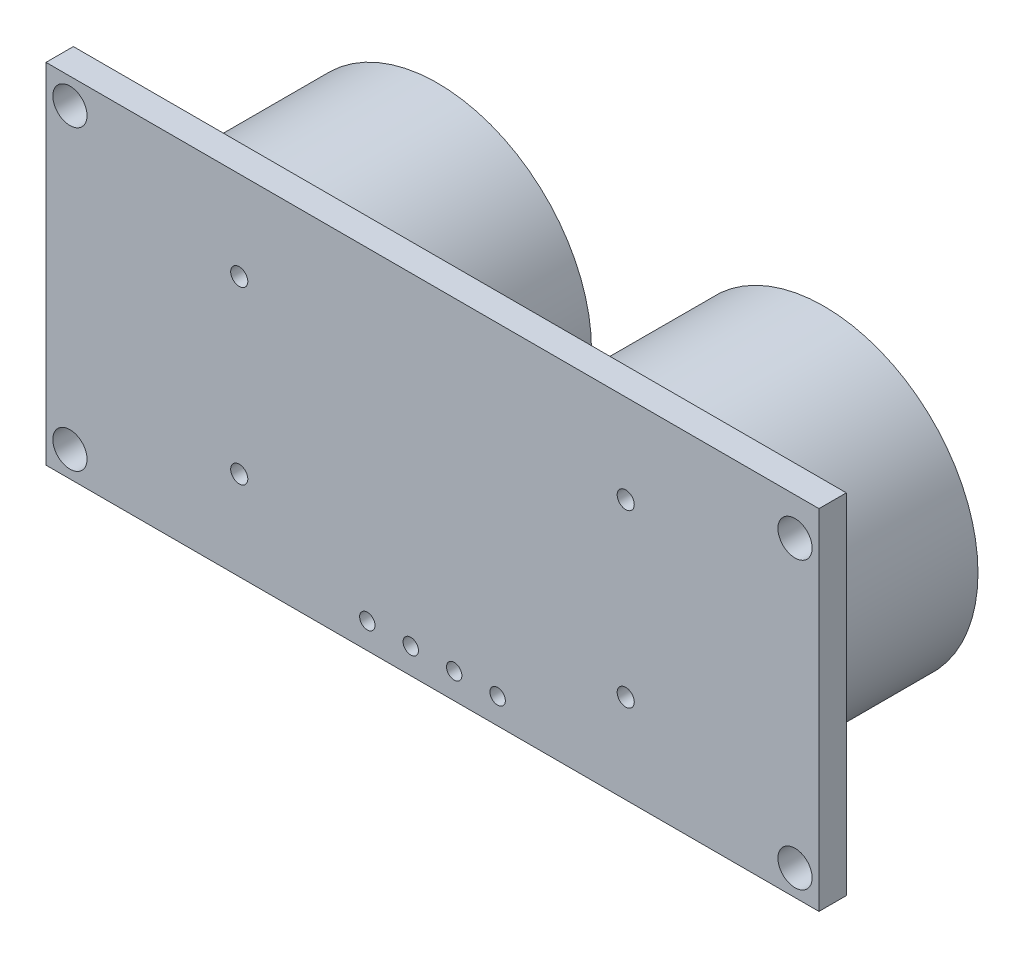
ISO-10303-21;
HEADER;
FILE_DESCRIPTION(('STEP AP214'),'2;1');
FILE_NAME('part.step','',(''),(''),'','','');
FILE_SCHEMA(('AUTOMOTIVE_DESIGN { 1 0 10303 214 1 1 1 1 }'));
ENDSEC;
DATA;
#1=APPLICATION_CONTEXT('core data for automotive mechanical design processes');
#2=APPLICATION_PROTOCOL_DEFINITION('international standard','automotive_design',2000,#1);
#3=PRODUCT_CONTEXT('',#1,'mechanical');
#4=PRODUCT('Part','Part','',(#3));
#5=PRODUCT_RELATED_PRODUCT_CATEGORY('part','',(#4));
#6=PRODUCT_DEFINITION_FORMATION('','',#4);
#7=PRODUCT_DEFINITION_CONTEXT('part definition',#1,'design');
#8=PRODUCT_DEFINITION('design','',#6,#7);
#9=PRODUCT_DEFINITION_SHAPE('','',#8);
#10=(LENGTH_UNIT() NAMED_UNIT(*) SI_UNIT(.MILLI.,.METRE.));
#11=(NAMED_UNIT(*) PLANE_ANGLE_UNIT() SI_UNIT($,.RADIAN.));
#12=(NAMED_UNIT(*) SI_UNIT($,.STERADIAN.) SOLID_ANGLE_UNIT());
#13=UNCERTAINTY_MEASURE_WITH_UNIT(LENGTH_MEASURE(1.E-05),#10,'distance_accuracy_value','');
#14=(GEOMETRIC_REPRESENTATION_CONTEXT(3) GLOBAL_UNCERTAINTY_ASSIGNED_CONTEXT((#13)) GLOBAL_UNIT_ASSIGNED_CONTEXT((#10,
#11,#12)) REPRESENTATION_CONTEXT('',''));
#15=CARTESIAN_POINT('',(0.,0.,0.));
#16=DIRECTION('',(0.,0.,1.));
#17=DIRECTION('',(1.,0.,0.));
#18=AXIS2_PLACEMENT_3D('',#15,#16,#17);
#19=CARTESIAN_POINT('',(-22.6,-10.2,1.6));
#20=DIRECTION('',(1.,0.,0.));
#21=DIRECTION('',(0.,0.,-1.));
#22=AXIS2_PLACEMENT_3D('',#19,#20,#21);
#23=PLANE('',#22);
#24=DIRECTION('',(0.,-1.,0.));
#25=VECTOR('',#24,1.);
#26=CARTESIAN_POINT('',(-22.6,-10.2,0.));
#27=LINE('',#26,#25);
#28=CARTESIAN_POINT('',(-22.6,10.2,0.));
#29=VERTEX_POINT('',#28);
#30=CARTESIAN_POINT('',(-22.6,-10.2,0.));
#31=VERTEX_POINT('',#30);
#32=EDGE_CURVE('E102',#29,#31,#27,.T.);
#33=ORIENTED_EDGE('',*,*,#32,.T.);
#34=DIRECTION('',(0.,0.,-1.));
#35=VECTOR('',#34,1.);
#36=CARTESIAN_POINT('',(-22.6,-10.2,1.6));
#37=LINE('',#36,#35);
#38=CARTESIAN_POINT('',(-22.6,-10.2,1.6));
#39=VERTEX_POINT('',#38);
#40=EDGE_CURVE('E93',#39,#31,#37,.T.);
#41=ORIENTED_EDGE('',*,*,#40,.F.);
#42=DIRECTION('',(0.,-1.,0.));
#43=VECTOR('',#42,1.);
#44=CARTESIAN_POINT('',(-22.6,-10.2,1.6));
#45=LINE('',#44,#43);
#46=CARTESIAN_POINT('',(-22.6,10.2,1.6));
#47=VERTEX_POINT('',#46);
#48=EDGE_CURVE('E87',#47,#39,#45,.T.);
#49=ORIENTED_EDGE('',*,*,#48,.F.);
#50=DIRECTION('',(0.,0.,-1.));
#51=VECTOR('',#50,1.);
#52=CARTESIAN_POINT('',(-22.6,10.2,1.6));
#53=LINE('',#52,#51);
#54=EDGE_CURVE('E98',#47,#29,#53,.T.);
#55=ORIENTED_EDGE('',*,*,#54,.T.);
#56=EDGE_LOOP('',(#33,#41,#49,#55));
#57=FACE_BOUND('',#56,.T.);
#58=ADVANCED_FACE('F35',(#57),#23,.F.);
#59=CARTESIAN_POINT('',(22.6,-10.2,1.6));
#60=DIRECTION('',(0.,1.,0.));
#61=DIRECTION('',(-1.,0.,0.));
#62=AXIS2_PLACEMENT_3D('',#59,#60,#61);
#63=PLANE('',#62);
#64=DIRECTION('',(1.,0.,0.));
#65=VECTOR('',#64,1.);
#66=CARTESIAN_POINT('',(22.6,-10.2,0.));
#67=LINE('',#66,#65);
#68=CARTESIAN_POINT('',(22.6,-10.2,0.));
#69=VERTEX_POINT('',#68);
#70=EDGE_CURVE('E92',#31,#69,#67,.T.);
#71=ORIENTED_EDGE('',*,*,#70,.T.);
#72=DIRECTION('',(0.,0.,-1.));
#73=VECTOR('',#72,1.);
#74=CARTESIAN_POINT('',(22.6,-10.2,1.6));
#75=LINE('',#74,#73);
#76=CARTESIAN_POINT('',(22.6,-10.2,1.6));
#77=VERTEX_POINT('',#76);
#78=EDGE_CURVE('E90',#77,#69,#75,.T.);
#79=ORIENTED_EDGE('',*,*,#78,.F.);
#80=DIRECTION('',(1.,0.,0.));
#81=VECTOR('',#80,1.);
#82=CARTESIAN_POINT('',(22.6,-10.2,1.6));
#83=LINE('',#82,#81);
#84=EDGE_CURVE('E82',#39,#77,#83,.T.);
#85=ORIENTED_EDGE('',*,*,#84,.F.);
#86=ORIENTED_EDGE('',*,*,#40,.T.);
#87=EDGE_LOOP('',(#71,#79,#85,#86));
#88=FACE_BOUND('',#87,.T.);
#89=ADVANCED_FACE('F91',(#88),#63,.F.);
#90=CARTESIAN_POINT('',(22.6,-10.2,1.6));
#91=DIRECTION('',(-1.,0.,0.));
#92=DIRECTION('',(0.,0.,1.));
#93=AXIS2_PLACEMENT_3D('',#90,#91,#92);
#94=PLANE('',#93);
#95=DIRECTION('',(0.,1.,0.));
#96=VECTOR('',#95,1.);
#97=CARTESIAN_POINT('',(22.6,-10.2,0.));
#98=LINE('',#97,#96);
#99=CARTESIAN_POINT('',(22.6,10.2,0.));
#100=VERTEX_POINT('',#99);
#101=EDGE_CURVE('E68',#69,#100,#98,.T.);
#102=ORIENTED_EDGE('',*,*,#101,.T.);
#103=DIRECTION('',(0.,0.,-1.));
#104=VECTOR('',#103,1.);
#105=CARTESIAN_POINT('',(22.6,10.2,1.6));
#106=LINE('',#105,#104);
#107=CARTESIAN_POINT('',(22.6,10.2,1.6));
#108=VERTEX_POINT('',#107);
#109=EDGE_CURVE('E94',#108,#100,#106,.T.);
#110=ORIENTED_EDGE('',*,*,#109,.F.);
#111=DIRECTION('',(0.,1.,0.));
#112=VECTOR('',#111,1.);
#113=CARTESIAN_POINT('',(22.6,-10.2,1.6));
#114=LINE('',#113,#112);
#115=EDGE_CURVE('E85',#77,#108,#114,.T.);
#116=ORIENTED_EDGE('',*,*,#115,.F.);
#117=ORIENTED_EDGE('',*,*,#78,.T.);
#118=EDGE_LOOP('',(#102,#110,#116,#117));
#119=FACE_BOUND('',#118,.T.);
#120=ADVANCED_FACE('F96',(#119),#94,.F.);
#121=CARTESIAN_POINT('',(22.6,10.2,1.6));
#122=DIRECTION('',(0.,-1.,0.));
#123=DIRECTION('',(1.,0.,0.));
#124=AXIS2_PLACEMENT_3D('',#121,#122,#123);
#125=PLANE('',#124);
#126=DIRECTION('',(-1.,0.,0.));
#127=VECTOR('',#126,1.);
#128=CARTESIAN_POINT('',(22.6,10.2,0.));
#129=LINE('',#128,#127);
#130=EDGE_CURVE('E74',#100,#29,#129,.T.);
#131=ORIENTED_EDGE('',*,*,#130,.T.);
#132=ORIENTED_EDGE('',*,*,#54,.F.);
#133=DIRECTION('',(-1.,0.,0.));
#134=VECTOR('',#133,1.);
#135=CARTESIAN_POINT('',(22.6,10.2,1.6));
#136=LINE('',#135,#134);
#137=EDGE_CURVE('E51',#108,#47,#136,.T.);
#138=ORIENTED_EDGE('',*,*,#137,.F.);
#139=ORIENTED_EDGE('',*,*,#109,.T.);
#140=EDGE_LOOP('',(#131,#132,#138,#139));
#141=FACE_BOUND('',#140,.T.);
#142=ADVANCED_FACE('F155',(#141),#125,.F.);
#143=CARTESIAN_POINT('',(0.,0.,1.6));
#144=DIRECTION('',(0.,0.,1.));
#145=DIRECTION('',(1.,0.,0.));
#146=AXIS2_PLACEMENT_3D('',#143,#144,#145);
#147=PLANE('',#146);
#148=CARTESIAN_POINT('',(-11.3,5.00000000000001,1.6));
#149=DIRECTION('',(0.,0.,1.));
#150=DIRECTION('',(-1.,0.,0.));
#151=AXIS2_PLACEMENT_3D('',#148,#149,#150);
#152=CIRCLE('',#151,0.500000000000001);
#153=CARTESIAN_POINT('',(-11.8,5.00000000000001,1.6));
#154=VERTEX_POINT('',#153);
#155=EDGE_CURVE('E397',#154,#154,#152,.T.);
#156=ORIENTED_EDGE('',*,*,#155,.F.);
#157=EDGE_LOOP('',(#156));
#158=FACE_BOUND('',#157,.T.);
#159=CARTESIAN_POINT('',(-11.3,-4.99999999999999,1.6));
#160=DIRECTION('',(0.,0.,1.));
#161=DIRECTION('',(-1.,0.,0.));
#162=AXIS2_PLACEMENT_3D('',#159,#160,#161);
#163=CIRCLE('',#162,0.500000000000001);
#164=CARTESIAN_POINT('',(-11.8,-4.99999999999999,1.6));
#165=VERTEX_POINT('',#164);
#166=EDGE_CURVE('E410',#165,#165,#163,.T.);
#167=ORIENTED_EDGE('',*,*,#166,.F.);
#168=EDGE_LOOP('',(#167));
#169=FACE_BOUND('',#168,.T.);
#170=CARTESIAN_POINT('',(11.3,-4.99999999999999,1.6));
#171=DIRECTION('',(0.,0.,1.));
#172=DIRECTION('',(1.,0.,0.));
#173=AXIS2_PLACEMENT_3D('',#170,#171,#172);
#174=CIRCLE('',#173,0.500000000000001);
#175=CARTESIAN_POINT('',(11.8,-4.99999999999999,1.6));
#176=VERTEX_POINT('',#175);
#177=EDGE_CURVE('E404',#176,#176,#174,.T.);
#178=ORIENTED_EDGE('',*,*,#177,.F.);
#179=EDGE_LOOP('',(#178));
#180=FACE_BOUND('',#179,.T.);
#181=CARTESIAN_POINT('',(11.3,5.00000000000001,1.6));
#182=DIRECTION('',(0.,0.,1.));
#183=DIRECTION('',(1.,0.,0.));
#184=AXIS2_PLACEMENT_3D('',#181,#182,#183);
#185=CIRCLE('',#184,0.500000000000001);
#186=CARTESIAN_POINT('',(11.8,5.00000000000001,1.6));
#187=VERTEX_POINT('',#186);
#188=EDGE_CURVE('E403',#187,#187,#185,.T.);
#189=ORIENTED_EDGE('',*,*,#188,.F.);
#190=EDGE_LOOP('',(#189));
#191=FACE_BOUND('',#190,.T.);
#192=CARTESIAN_POINT('',(-3.81,-8.7,1.6));
#193=DIRECTION('',(0.,0.,1.));
#194=DIRECTION('',(1.,0.,0.));
#195=AXIS2_PLACEMENT_3D('',#192,#193,#194);
#196=CIRCLE('',#195,0.45);
#197=CARTESIAN_POINT('',(-3.36,-8.7,1.6));
#198=VERTEX_POINT('',#197);
#199=EDGE_CURVE('E425',#198,#198,#196,.T.);
#200=ORIENTED_EDGE('',*,*,#199,.F.);
#201=EDGE_LOOP('',(#200));
#202=FACE_BOUND('',#201,.T.);
#203=CARTESIAN_POINT('',(21.2,8.,1.6));
#204=DIRECTION('',(0.,0.,1.));
#205=DIRECTION('',(1.,0.,0.));
#206=AXIS2_PLACEMENT_3D('',#203,#204,#205);
#207=CIRCLE('',#206,1.);
#208=CARTESIAN_POINT('',(22.2,8.,1.6));
#209=VERTEX_POINT('',#208);
#210=EDGE_CURVE('E438',#209,#209,#207,.T.);
#211=ORIENTED_EDGE('',*,*,#210,.F.);
#212=EDGE_LOOP('',(#211));
#213=FACE_BOUND('',#212,.T.);
#214=CARTESIAN_POINT('',(-21.2,8.7,1.6));
#215=DIRECTION('',(0.,0.,1.));
#216=DIRECTION('',(1.,0.,0.));
#217=AXIS2_PLACEMENT_3D('',#214,#215,#216);
#218=CIRCLE('',#217,1.);
#219=CARTESIAN_POINT('',(-20.2,8.7,1.6));
#220=VERTEX_POINT('',#219);
#221=EDGE_CURVE('E437',#220,#220,#218,.T.);
#222=ORIENTED_EDGE('',*,*,#221,.F.);
#223=EDGE_LOOP('',(#222));
#224=FACE_BOUND('',#223,.T.);
#225=CARTESIAN_POINT('',(21.2,-8.7,1.6));
#226=DIRECTION('',(0.,0.,1.));
#227=DIRECTION('',(1.,0.,0.));
#228=AXIS2_PLACEMENT_3D('',#225,#226,#227);
#229=CIRCLE('',#228,1.);
#230=CARTESIAN_POINT('',(22.2,-8.7,1.6));
#231=VERTEX_POINT('',#230);
#232=EDGE_CURVE('E446',#231,#231,#229,.T.);
#233=ORIENTED_EDGE('',*,*,#232,.F.);
#234=EDGE_LOOP('',(#233));
#235=FACE_BOUND('',#234,.T.);
#236=CARTESIAN_POINT('',(-1.27,-8.7,1.6));
#237=DIRECTION('',(0.,0.,1.));
#238=DIRECTION('',(1.,0.,0.));
#239=AXIS2_PLACEMENT_3D('',#236,#237,#238);
#240=CIRCLE('',#239,0.45);
#241=CARTESIAN_POINT('',(-0.819999999999998,-8.7,1.6));
#242=VERTEX_POINT('',#241);
#243=EDGE_CURVE('E426',#242,#242,#240,.T.);
#244=ORIENTED_EDGE('',*,*,#243,.F.);
#245=EDGE_LOOP('',(#244));
#246=FACE_BOUND('',#245,.T.);
#247=CARTESIAN_POINT('',(1.27,-8.7,1.6));
#248=DIRECTION('',(0.,0.,1.));
#249=DIRECTION('',(1.,0.,0.));
#250=AXIS2_PLACEMENT_3D('',#247,#248,#249);
#251=CIRCLE('',#250,0.45);
#252=CARTESIAN_POINT('',(1.72,-8.7,1.6));
#253=VERTEX_POINT('',#252);
#254=EDGE_CURVE('E430',#253,#253,#251,.T.);
#255=ORIENTED_EDGE('',*,*,#254,.F.);
#256=EDGE_LOOP('',(#255));
#257=FACE_BOUND('',#256,.T.);
#258=CARTESIAN_POINT('',(3.81,-8.7,1.6));
#259=DIRECTION('',(0.,0.,1.));
#260=DIRECTION('',(1.,0.,0.));
#261=AXIS2_PLACEMENT_3D('',#258,#259,#260);
#262=CIRCLE('',#261,0.45);
#263=CARTESIAN_POINT('',(4.26,-8.7,1.6));
#264=VERTEX_POINT('',#263);
#265=EDGE_CURVE('E421',#264,#264,#262,.T.);
#266=ORIENTED_EDGE('',*,*,#265,.F.);
#267=EDGE_LOOP('',(#266));
#268=FACE_BOUND('',#267,.T.);
#269=CARTESIAN_POINT('',(-21.2,-8.7,1.6));
#270=DIRECTION('',(0.,0.,1.));
#271=DIRECTION('',(1.,0.,0.));
#272=AXIS2_PLACEMENT_3D('',#269,#270,#271);
#273=CIRCLE('',#272,1.);
#274=CARTESIAN_POINT('',(-20.2,-8.7,1.6));
#275=VERTEX_POINT('',#274);
#276=EDGE_CURVE('E445',#275,#275,#273,.T.);
#277=ORIENTED_EDGE('',*,*,#276,.F.);
#278=EDGE_LOOP('',(#277));
#279=FACE_BOUND('',#278,.T.);
#280=ORIENTED_EDGE('',*,*,#48,.T.);
#281=ORIENTED_EDGE('',*,*,#84,.T.);
#282=ORIENTED_EDGE('',*,*,#115,.T.);
#283=ORIENTED_EDGE('',*,*,#137,.T.);
#284=EDGE_LOOP('',(#280,#281,#282,#283));
#285=FACE_BOUND('',#284,.T.);
#286=ADVANCED_FACE('F83',(#158,#169,#180,#191,#202,#213,#224,#235,#246,#257,#268,#279,#285),
#147,.T.);
#287=CARTESIAN_POINT('',(0.,0.,0.));
#288=DIRECTION('',(0.,0.,1.));
#289=DIRECTION('',(1.,0.,0.));
#290=AXIS2_PLACEMENT_3D('',#287,#288,#289);
#291=PLANE('',#290);
#292=CARTESIAN_POINT('',(-11.3,0.,0.));
#293=DIRECTION('',(0.,0.,1.));
#294=DIRECTION('',(1.,0.,0.));
#295=AXIS2_PLACEMENT_3D('',#292,#293,#294);
#296=CIRCLE('',#295,9.);
#297=CARTESIAN_POINT('',(-2.3,0.,0.));
#298=VERTEX_POINT('',#297);
#299=EDGE_CURVE('E11',#298,#298,#296,.F.);
#300=ORIENTED_EDGE('',*,*,#299,.F.);
#301=EDGE_LOOP('',(#300));
#302=FACE_BOUND('',#301,.T.);
#303=CARTESIAN_POINT('',(11.3,0.,0.));
#304=DIRECTION('',(0.,0.,1.));
#305=DIRECTION('',(1.,0.,0.));
#306=AXIS2_PLACEMENT_3D('',#303,#304,#305);
#307=CIRCLE('',#306,9.);
#308=CARTESIAN_POINT('',(20.3,0.,0.));
#309=VERTEX_POINT('',#308);
#310=EDGE_CURVE('E43',#309,#309,#307,.F.);
#311=ORIENTED_EDGE('',*,*,#310,.F.);
#312=EDGE_LOOP('',(#311));
#313=FACE_BOUND('',#312,.T.);
#314=CARTESIAN_POINT('',(-3.81,-8.7,0.));
#315=DIRECTION('',(0.,0.,1.));
#316=DIRECTION('',(1.,0.,0.));
#317=AXIS2_PLACEMENT_3D('',#314,#315,#316);
#318=CIRCLE('',#317,0.45);
#319=CARTESIAN_POINT('',(-3.36,-8.7,0.));
#320=VERTEX_POINT('',#319);
#321=EDGE_CURVE('E125',#320,#320,#318,.T.);
#322=ORIENTED_EDGE('',*,*,#321,.T.);
#323=EDGE_LOOP('',(#322));
#324=FACE_BOUND('',#323,.T.);
#325=CARTESIAN_POINT('',(21.2,8.,0.));
#326=DIRECTION('',(0.,0.,1.));
#327=DIRECTION('',(1.,0.,0.));
#328=AXIS2_PLACEMENT_3D('',#325,#326,#327);
#329=CIRCLE('',#328,1.);
#330=CARTESIAN_POINT('',(22.2,8.,0.));
#331=VERTEX_POINT('',#330);
#332=EDGE_CURVE('E129',#331,#331,#329,.T.);
#333=ORIENTED_EDGE('',*,*,#332,.T.);
#334=EDGE_LOOP('',(#333));
#335=FACE_BOUND('',#334,.T.);
#336=CARTESIAN_POINT('',(-21.2,8.7,0.));
#337=DIRECTION('',(0.,0.,1.));
#338=DIRECTION('',(1.,0.,0.));
#339=AXIS2_PLACEMENT_3D('',#336,#337,#338);
#340=CIRCLE('',#339,1.);
#341=CARTESIAN_POINT('',(-20.2,8.7,0.));
#342=VERTEX_POINT('',#341);
#343=EDGE_CURVE('E133',#342,#342,#340,.T.);
#344=ORIENTED_EDGE('',*,*,#343,.T.);
#345=EDGE_LOOP('',(#344));
#346=FACE_BOUND('',#345,.T.);
#347=CARTESIAN_POINT('',(21.2,-8.7,0.));
#348=DIRECTION('',(0.,0.,1.));
#349=DIRECTION('',(1.,0.,0.));
#350=AXIS2_PLACEMENT_3D('',#347,#348,#349);
#351=CIRCLE('',#350,1.);
#352=CARTESIAN_POINT('',(22.2,-8.7,0.));
#353=VERTEX_POINT('',#352);
#354=EDGE_CURVE('E137',#353,#353,#351,.T.);
#355=ORIENTED_EDGE('',*,*,#354,.T.);
#356=EDGE_LOOP('',(#355));
#357=FACE_BOUND('',#356,.T.);
#358=CARTESIAN_POINT('',(-1.27,-8.7,0.));
#359=DIRECTION('',(0.,0.,1.));
#360=DIRECTION('',(1.,0.,0.));
#361=AXIS2_PLACEMENT_3D('',#358,#359,#360);
#362=CIRCLE('',#361,0.45);
#363=CARTESIAN_POINT('',(-0.819999999999998,-8.7,0.));
#364=VERTEX_POINT('',#363);
#365=EDGE_CURVE('E141',#364,#364,#362,.T.);
#366=ORIENTED_EDGE('',*,*,#365,.T.);
#367=EDGE_LOOP('',(#366));
#368=FACE_BOUND('',#367,.T.);
#369=CARTESIAN_POINT('',(1.27,-8.7,0.));
#370=DIRECTION('',(0.,0.,1.));
#371=DIRECTION('',(1.,0.,0.));
#372=AXIS2_PLACEMENT_3D('',#369,#370,#371);
#373=CIRCLE('',#372,0.45);
#374=CARTESIAN_POINT('',(1.72,-8.7,0.));
#375=VERTEX_POINT('',#374);
#376=EDGE_CURVE('E145',#375,#375,#373,.T.);
#377=ORIENTED_EDGE('',*,*,#376,.T.);
#378=EDGE_LOOP('',(#377));
#379=FACE_BOUND('',#378,.T.);
#380=CARTESIAN_POINT('',(3.81,-8.7,0.));
#381=DIRECTION('',(0.,0.,1.));
#382=DIRECTION('',(1.,0.,0.));
#383=AXIS2_PLACEMENT_3D('',#380,#381,#382);
#384=CIRCLE('',#383,0.45);
#385=CARTESIAN_POINT('',(4.26,-8.7,0.));
#386=VERTEX_POINT('',#385);
#387=EDGE_CURVE('E149',#386,#386,#384,.T.);
#388=ORIENTED_EDGE('',*,*,#387,.T.);
#389=EDGE_LOOP('',(#388));
#390=FACE_BOUND('',#389,.T.);
#391=CARTESIAN_POINT('',(-21.2,-8.7,0.));
#392=DIRECTION('',(0.,0.,1.));
#393=DIRECTION('',(1.,0.,0.));
#394=AXIS2_PLACEMENT_3D('',#391,#392,#393);
#395=CIRCLE('',#394,1.);
#396=CARTESIAN_POINT('',(-20.2,-8.7,0.));
#397=VERTEX_POINT('',#396);
#398=EDGE_CURVE('E105',#397,#397,#395,.T.);
#399=ORIENTED_EDGE('',*,*,#398,.T.);
#400=EDGE_LOOP('',(#399));
#401=FACE_BOUND('',#400,.T.);
#402=ORIENTED_EDGE('',*,*,#32,.F.);
#403=ORIENTED_EDGE('',*,*,#130,.F.);
#404=ORIENTED_EDGE('',*,*,#101,.F.);
#405=ORIENTED_EDGE('',*,*,#70,.F.);
#406=EDGE_LOOP('',(#402,#403,#404,#405));
#407=FACE_BOUND('',#406,.T.);
#408=ADVANCED_FACE('F116',(#302,#313,#324,#335,#346,#357,#368,#379,#390,#401,#407),#291,.F.);
#409=CARTESIAN_POINT('',(-21.2,-8.7,0.));
#410=DIRECTION('',(0.,0.,1.));
#411=DIRECTION('',(1.,0.,0.));
#412=AXIS2_PLACEMENT_3D('',#409,#410,#411);
#413=CYLINDRICAL_SURFACE('',#412,1.);
#414=ORIENTED_EDGE('',*,*,#398,.F.);
#415=EDGE_LOOP('',(#414));
#416=FACE_BOUND('',#415,.T.);
#417=ORIENTED_EDGE('',*,*,#276,.T.);
#418=EDGE_LOOP('',(#417));
#419=FACE_BOUND('',#418,.T.);
#420=ADVANCED_FACE('F119',(#416,#419),#413,.F.);
#421=CARTESIAN_POINT('',(3.81,-8.7,0.));
#422=DIRECTION('',(0.,0.,1.));
#423=DIRECTION('',(1.,0.,0.));
#424=AXIS2_PLACEMENT_3D('',#421,#422,#423);
#425=CYLINDRICAL_SURFACE('',#424,0.45);
#426=ORIENTED_EDGE('',*,*,#387,.F.);
#427=EDGE_LOOP('',(#426));
#428=FACE_BOUND('',#427,.T.);
#429=ORIENTED_EDGE('',*,*,#265,.T.);
#430=EDGE_LOOP('',(#429));
#431=FACE_BOUND('',#430,.T.);
#432=ADVANCED_FACE('F189',(#428,#431),#425,.F.);
#433=CARTESIAN_POINT('',(1.27,-8.7,0.));
#434=DIRECTION('',(0.,0.,1.));
#435=DIRECTION('',(1.,0.,0.));
#436=AXIS2_PLACEMENT_3D('',#433,#434,#435);
#437=CYLINDRICAL_SURFACE('',#436,0.45);
#438=ORIENTED_EDGE('',*,*,#376,.F.);
#439=EDGE_LOOP('',(#438));
#440=FACE_BOUND('',#439,.T.);
#441=ORIENTED_EDGE('',*,*,#254,.T.);
#442=EDGE_LOOP('',(#441));
#443=FACE_BOUND('',#442,.T.);
#444=ADVANCED_FACE('F200',(#440,#443),#437,.F.);
#445=CARTESIAN_POINT('',(-1.27,-8.7,0.));
#446=DIRECTION('',(0.,0.,1.));
#447=DIRECTION('',(1.,0.,0.));
#448=AXIS2_PLACEMENT_3D('',#445,#446,#447);
#449=CYLINDRICAL_SURFACE('',#448,0.45);
#450=ORIENTED_EDGE('',*,*,#365,.F.);
#451=EDGE_LOOP('',(#450));
#452=FACE_BOUND('',#451,.T.);
#453=ORIENTED_EDGE('',*,*,#243,.T.);
#454=EDGE_LOOP('',(#453));
#455=FACE_BOUND('',#454,.T.);
#456=ADVANCED_FACE('F210',(#452,#455),#449,.F.);
#457=CARTESIAN_POINT('',(21.2,-8.7,0.));
#458=DIRECTION('',(0.,0.,1.));
#459=DIRECTION('',(1.,0.,0.));
#460=AXIS2_PLACEMENT_3D('',#457,#458,#459);
#461=CYLINDRICAL_SURFACE('',#460,1.);
#462=ORIENTED_EDGE('',*,*,#354,.F.);
#463=EDGE_LOOP('',(#462));
#464=FACE_BOUND('',#463,.T.);
#465=ORIENTED_EDGE('',*,*,#232,.T.);
#466=EDGE_LOOP('',(#465));
#467=FACE_BOUND('',#466,.T.);
#468=ADVANCED_FACE('F220',(#464,#467),#461,.F.);
#469=CARTESIAN_POINT('',(-21.2,8.7,0.));
#470=DIRECTION('',(0.,0.,1.));
#471=DIRECTION('',(1.,0.,0.));
#472=AXIS2_PLACEMENT_3D('',#469,#470,#471);
#473=CYLINDRICAL_SURFACE('',#472,1.);
#474=ORIENTED_EDGE('',*,*,#343,.F.);
#475=EDGE_LOOP('',(#474));
#476=FACE_BOUND('',#475,.T.);
#477=ORIENTED_EDGE('',*,*,#221,.T.);
#478=EDGE_LOOP('',(#477));
#479=FACE_BOUND('',#478,.T.);
#480=ADVANCED_FACE('F230',(#476,#479),#473,.F.);
#481=CARTESIAN_POINT('',(21.2,8.,0.));
#482=DIRECTION('',(0.,0.,1.));
#483=DIRECTION('',(1.,0.,0.));
#484=AXIS2_PLACEMENT_3D('',#481,#482,#483);
#485=CYLINDRICAL_SURFACE('',#484,1.);
#486=ORIENTED_EDGE('',*,*,#332,.F.);
#487=EDGE_LOOP('',(#486));
#488=FACE_BOUND('',#487,.T.);
#489=ORIENTED_EDGE('',*,*,#210,.T.);
#490=EDGE_LOOP('',(#489));
#491=FACE_BOUND('',#490,.T.);
#492=ADVANCED_FACE('F240',(#488,#491),#485,.F.);
#493=CARTESIAN_POINT('',(-3.81,-8.7,0.));
#494=DIRECTION('',(0.,0.,1.));
#495=DIRECTION('',(1.,0.,0.));
#496=AXIS2_PLACEMENT_3D('',#493,#494,#495);
#497=CYLINDRICAL_SURFACE('',#496,0.45);
#498=ORIENTED_EDGE('',*,*,#321,.F.);
#499=EDGE_LOOP('',(#498));
#500=FACE_BOUND('',#499,.T.);
#501=ORIENTED_EDGE('',*,*,#199,.T.);
#502=EDGE_LOOP('',(#501));
#503=FACE_BOUND('',#502,.T.);
#504=ADVANCED_FACE('F250',(#500,#503),#497,.F.);
#505=CARTESIAN_POINT('',(11.3,5.00000000000001,0.));
#506=DIRECTION('',(0.,0.,1.));
#507=DIRECTION('',(1.,0.,0.));
#508=AXIS2_PLACEMENT_3D('',#505,#506,#507);
#509=CYLINDRICAL_SURFACE('',#508,0.500000000000001);
#510=CARTESIAN_POINT('',(11.3,5.00000000000001,0.));
#511=DIRECTION('',(0.,0.,1.));
#512=DIRECTION('',(1.,0.,0.));
#513=AXIS2_PLACEMENT_3D('',#510,#511,#512);
#514=CIRCLE('',#513,0.500000000000001);
#515=CARTESIAN_POINT('',(11.8,5.00000000000001,0.));
#516=VERTEX_POINT('',#515);
#517=EDGE_CURVE('E418',#516,#516,#514,.T.);
#518=ORIENTED_EDGE('',*,*,#517,.F.);
#519=EDGE_LOOP('',(#518));
#520=FACE_BOUND('',#519,.T.);
#521=ORIENTED_EDGE('',*,*,#188,.T.);
#522=EDGE_LOOP('',(#521));
#523=FACE_BOUND('',#522,.T.);
#524=ADVANCED_FACE('F260',(#520,#523),#509,.F.);
#525=CARTESIAN_POINT('',(11.3,-4.99999999999999,0.));
#526=DIRECTION('',(0.,0.,1.));
#527=DIRECTION('',(1.,0.,0.));
#528=AXIS2_PLACEMENT_3D('',#525,#526,#527);
#529=CYLINDRICAL_SURFACE('',#528,0.500000000000001);
#530=CARTESIAN_POINT('',(11.3,-4.99999999999999,0.));
#531=DIRECTION('',(0.,0.,1.));
#532=DIRECTION('',(1.,0.,0.));
#533=AXIS2_PLACEMENT_3D('',#530,#531,#532);
#534=CIRCLE('',#533,0.500000000000001);
#535=CARTESIAN_POINT('',(11.8,-4.99999999999999,0.));
#536=VERTEX_POINT('',#535);
#537=EDGE_CURVE('E400',#536,#536,#534,.T.);
#538=ORIENTED_EDGE('',*,*,#537,.F.);
#539=EDGE_LOOP('',(#538));
#540=FACE_BOUND('',#539,.T.);
#541=ORIENTED_EDGE('',*,*,#177,.T.);
#542=EDGE_LOOP('',(#541));
#543=FACE_BOUND('',#542,.T.);
#544=ADVANCED_FACE('F275',(#540,#543),#529,.F.);
#545=CARTESIAN_POINT('',(-11.3,-4.99999999999999,0.));
#546=DIRECTION('',(0.,0.,1.));
#547=DIRECTION('',(1.,0.,0.));
#548=AXIS2_PLACEMENT_3D('',#545,#546,#547);
#549=CYLINDRICAL_SURFACE('',#548,0.500000000000001);
#550=CARTESIAN_POINT('',(-11.3,-4.99999999999999,0.));
#551=DIRECTION('',(0.,0.,1.));
#552=DIRECTION('',(-1.,0.,0.));
#553=AXIS2_PLACEMENT_3D('',#550,#551,#552);
#554=CIRCLE('',#553,0.500000000000001);
#555=CARTESIAN_POINT('',(-11.8,-4.99999999999999,0.));
#556=VERTEX_POINT('',#555);
#557=EDGE_CURVE('E407',#556,#556,#554,.T.);
#558=ORIENTED_EDGE('',*,*,#557,.F.);
#559=EDGE_LOOP('',(#558));
#560=FACE_BOUND('',#559,.T.);
#561=ORIENTED_EDGE('',*,*,#166,.T.);
#562=EDGE_LOOP('',(#561));
#563=FACE_BOUND('',#562,.T.);
#564=ADVANCED_FACE('F285',(#560,#563),#549,.F.);
#565=CARTESIAN_POINT('',(-11.3,5.00000000000001,0.));
#566=DIRECTION('',(0.,0.,1.));
#567=DIRECTION('',(1.,0.,0.));
#568=AXIS2_PLACEMENT_3D('',#565,#566,#567);
#569=CYLINDRICAL_SURFACE('',#568,0.500000000000001);
#570=CARTESIAN_POINT('',(-11.3,5.00000000000001,0.));
#571=DIRECTION('',(0.,0.,1.));
#572=DIRECTION('',(-1.,0.,0.));
#573=AXIS2_PLACEMENT_3D('',#570,#571,#572);
#574=CIRCLE('',#573,0.500000000000001);
#575=CARTESIAN_POINT('',(-11.8,5.00000000000001,0.));
#576=VERTEX_POINT('',#575);
#577=EDGE_CURVE('E413',#576,#576,#574,.T.);
#578=ORIENTED_EDGE('',*,*,#577,.F.);
#579=EDGE_LOOP('',(#578));
#580=FACE_BOUND('',#579,.T.);
#581=ORIENTED_EDGE('',*,*,#155,.T.);
#582=EDGE_LOOP('',(#581));
#583=FACE_BOUND('',#582,.T.);
#584=ADVANCED_FACE('F295',(#580,#583),#569,.F.);
#585=CARTESIAN_POINT('',(11.3,0.,0.));
#586=DIRECTION('',(0.,0.,-1.));
#587=DIRECTION('',(-1.,0.,0.));
#588=AXIS2_PLACEMENT_3D('',#585,#586,#587);
#589=PLANE('',#588);
#590=ORIENTED_EDGE('',*,*,#537,.T.);
#591=EDGE_LOOP('',(#590));
#592=FACE_BOUND('',#591,.T.);
#593=ADVANCED_FACE('F305',(#592),#589,.F.);
#594=ORIENTED_EDGE('',*,*,#517,.T.);
#595=EDGE_LOOP('',(#594));
#596=FACE_BOUND('',#595,.T.);
#597=ADVANCED_FACE('F320',(#596),#589,.F.);
#598=CARTESIAN_POINT('',(11.3,0.,-10.));
#599=DIRECTION('',(0.,0.,1.));
#600=DIRECTION('',(1.,0.,0.));
#601=AXIS2_PLACEMENT_3D('',#598,#599,#600);
#602=CYLINDRICAL_SURFACE('',#601,9.);
#603=CARTESIAN_POINT('',(11.3,0.,-10.));
#604=DIRECTION('',(0.,0.,-1.));
#605=DIRECTION('',(-1.,0.,0.));
#606=AXIS2_PLACEMENT_3D('',#603,#604,#605);
#607=CIRCLE('',#606,9.);
#608=CARTESIAN_POINT('',(2.3,0.,-10.));
#609=VERTEX_POINT('',#608);
#610=EDGE_CURVE('E394',#609,#609,#607,.T.);
#611=ORIENTED_EDGE('',*,*,#610,.F.);
#612=EDGE_LOOP('',(#611));
#613=FACE_BOUND('',#612,.T.);
#614=ORIENTED_EDGE('',*,*,#310,.T.);
#615=EDGE_LOOP('',(#614));
#616=FACE_BOUND('',#615,.T.);
#617=ADVANCED_FACE('F114',(#613,#616),#602,.T.);
#618=CARTESIAN_POINT('',(11.3,0.,-10.));
#619=DIRECTION('',(0.,0.,-1.));
#620=DIRECTION('',(-1.,0.,0.));
#621=AXIS2_PLACEMENT_3D('',#618,#619,#620);
#622=PLANE('',#621);
#623=ORIENTED_EDGE('',*,*,#610,.T.);
#624=EDGE_LOOP('',(#623));
#625=FACE_BOUND('',#624,.T.);
#626=ADVANCED_FACE('F338',(#625),#622,.T.);
#627=CARTESIAN_POINT('',(-11.3,0.,0.));
#628=DIRECTION('',(0.,0.,1.));
#629=DIRECTION('',(1.,0.,0.));
#630=AXIS2_PLACEMENT_3D('',#627,#628,#629);
#631=PLANE('',#630);
#632=ORIENTED_EDGE('',*,*,#577,.T.);
#633=EDGE_LOOP('',(#632));
#634=FACE_BOUND('',#633,.T.);
#635=ADVANCED_FACE('F348',(#634),#631,.T.);
#636=ORIENTED_EDGE('',*,*,#557,.T.);
#637=EDGE_LOOP('',(#636));
#638=FACE_BOUND('',#637,.T.);
#639=ADVANCED_FACE('F358',(#638),#631,.T.);
#640=CARTESIAN_POINT('',(-11.3,0.,-10.));
#641=DIRECTION('',(0.,0.,1.));
#642=DIRECTION('',(1.,0.,0.));
#643=AXIS2_PLACEMENT_3D('',#640,#641,#642);
#644=CYLINDRICAL_SURFACE('',#643,9.);
#645=CARTESIAN_POINT('',(-11.3,0.,-10.));
#646=DIRECTION('',(0.,0.,-1.));
#647=DIRECTION('',(1.,0.,0.));
#648=AXIS2_PLACEMENT_3D('',#645,#646,#647);
#649=CIRCLE('',#648,9.);
#650=CARTESIAN_POINT('',(-2.3,0.,-10.));
#651=VERTEX_POINT('',#650);
#652=EDGE_CURVE('E393',#651,#651,#649,.T.);
#653=ORIENTED_EDGE('',*,*,#652,.F.);
#654=EDGE_LOOP('',(#653));
#655=FACE_BOUND('',#654,.T.);
#656=ORIENTED_EDGE('',*,*,#299,.T.);
#657=EDGE_LOOP('',(#656));
#658=FACE_BOUND('',#657,.T.);
#659=ADVANCED_FACE('F368',(#655,#658),#644,.T.);
#660=CARTESIAN_POINT('',(-11.3,0.,-10.));
#661=DIRECTION('',(0.,0.,1.));
#662=DIRECTION('',(1.,0.,0.));
#663=AXIS2_PLACEMENT_3D('',#660,#661,#662);
#664=PLANE('',#663);
#665=ORIENTED_EDGE('',*,*,#652,.T.);
#666=EDGE_LOOP('',(#665));
#667=FACE_BOUND('',#666,.T.);
#668=ADVANCED_FACE('F377',(#667),#664,.F.);
#669=CLOSED_SHELL('',(#58,#89,#120,#142,#286,#408,#420,#432,#444,#456,#468,#480,#492,#504,#524,
#544,#564,#584,#593,#597,#617,#626,#635,#639,#659,#668));
#670=MANIFOLD_SOLID_BREP('B2',#669);
#671=ADVANCED_BREP_SHAPE_REPRESENTATION('',(#18,#670),#14);
#672=SHAPE_DEFINITION_REPRESENTATION(#9,#671);
ENDSEC;
END-ISO-10303-21;
